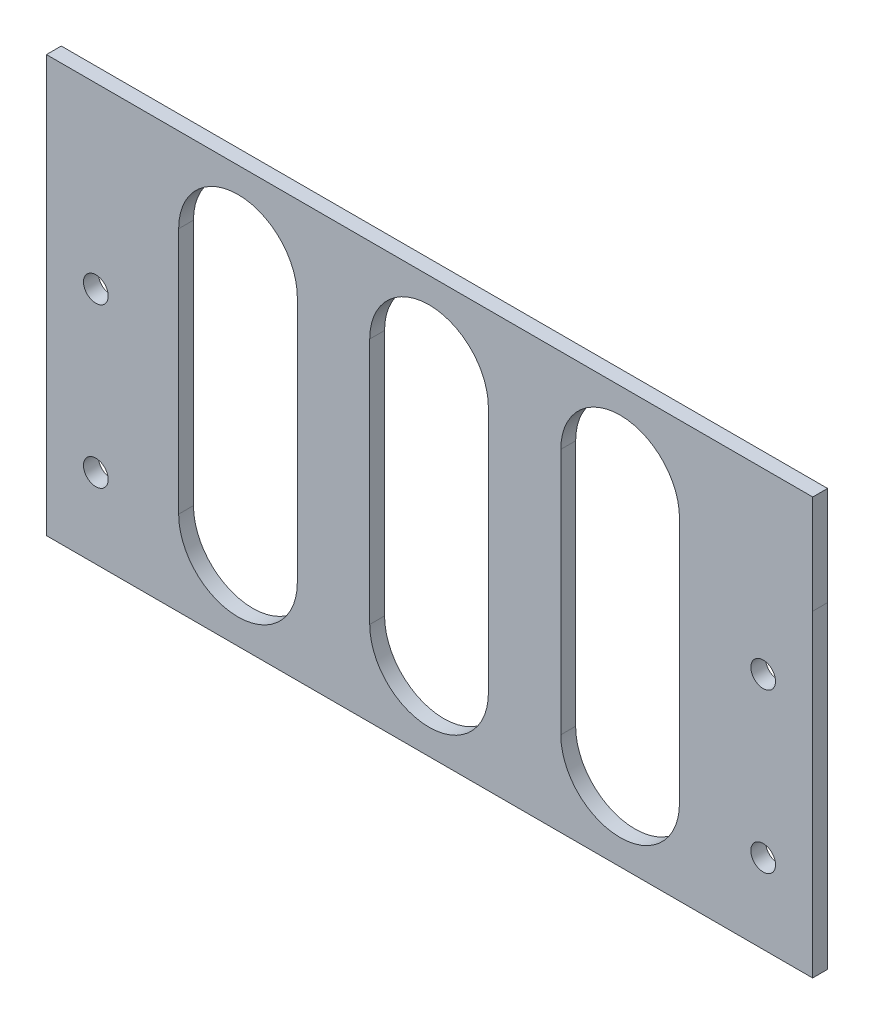
ISO-10303-21;
HEADER;
FILE_DESCRIPTION(('STEP AP214'),'2;1');
FILE_NAME('part.step','',(''),(''),'','','');
FILE_SCHEMA(('AUTOMOTIVE_DESIGN { 1 0 10303 214 1 1 1 1 }'));
ENDSEC;
DATA;
#1=APPLICATION_CONTEXT('core data for automotive mechanical design processes');
#2=APPLICATION_PROTOCOL_DEFINITION('international standard','automotive_design',2000,#1);
#3=PRODUCT_CONTEXT('',#1,'mechanical');
#4=PRODUCT('Part','Part','',(#3));
#5=PRODUCT_RELATED_PRODUCT_CATEGORY('part','',(#4));
#6=PRODUCT_DEFINITION_FORMATION('','',#4);
#7=PRODUCT_DEFINITION_CONTEXT('part definition',#1,'design');
#8=PRODUCT_DEFINITION('design','',#6,#7);
#9=PRODUCT_DEFINITION_SHAPE('','',#8);
#10=(LENGTH_UNIT() NAMED_UNIT(*) SI_UNIT(.MILLI.,.METRE.));
#11=(NAMED_UNIT(*) PLANE_ANGLE_UNIT() SI_UNIT($,.RADIAN.));
#12=(NAMED_UNIT(*) SI_UNIT($,.STERADIAN.) SOLID_ANGLE_UNIT());
#13=UNCERTAINTY_MEASURE_WITH_UNIT(LENGTH_MEASURE(1.E-05),#10,'distance_accuracy_value','');
#14=(GEOMETRIC_REPRESENTATION_CONTEXT(3) GLOBAL_UNCERTAINTY_ASSIGNED_CONTEXT((#13)) GLOBAL_UNIT_ASSIGNED_CONTEXT((#10,
#11,#12)) REPRESENTATION_CONTEXT('',''));
#15=CARTESIAN_POINT('',(0.,0.,0.));
#16=DIRECTION('',(0.,0.,1.));
#17=DIRECTION('',(1.,0.,0.));
#18=AXIS2_PLACEMENT_3D('',#15,#16,#17);
#19=CARTESIAN_POINT('',(0.,0.,0.));
#20=DIRECTION('',(0.,1.,0.));
#21=DIRECTION('',(0.,0.,1.));
#22=AXIS2_PLACEMENT_3D('',#19,#20,#21);
#23=PLANE('',#22);
#24=DIRECTION('',(0.,0.,1.));
#25=VECTOR('',#24,1.);
#26=CARTESIAN_POINT('',(-77.925054897268,0.,-1.49999999999998));
#27=LINE('',#26,#25);
#28=CARTESIAN_POINT('',(-77.925054897268,0.,-1.49999999999998));
#29=VERTEX_POINT('',#28);
#30=CARTESIAN_POINT('',(-77.925054897268,0.,1.50000000000002));
#31=VERTEX_POINT('',#30);
#32=EDGE_CURVE('E384',#29,#31,#27,.T.);
#33=ORIENTED_EDGE('',*,*,#32,.F.);
#34=DIRECTION('',(-1.,0.,0.));
#35=VECTOR('',#34,1.);
#36=CARTESIAN_POINT('',(-77.925054897268,0.,-1.49999999999998));
#37=LINE('',#36,#35);
#38=CARTESIAN_POINT('',(77.054945102732,0.,-1.49999999999998));
#39=VERTEX_POINT('',#38);
#40=EDGE_CURVE('E399',#39,#29,#37,.T.);
#41=ORIENTED_EDGE('',*,*,#40,.F.);
#42=DIRECTION('',(0.,0.,-1.));
#43=VECTOR('',#42,1.);
#44=CARTESIAN_POINT('',(77.054945102732,0.,-1.49999999999998));
#45=LINE('',#44,#43);
#46=CARTESIAN_POINT('',(77.0549451027321,0.,1.50000000000002));
#47=VERTEX_POINT('',#46);
#48=EDGE_CURVE('E395',#47,#39,#45,.T.);
#49=ORIENTED_EDGE('',*,*,#48,.F.);
#50=DIRECTION('',(1.,0.,0.));
#51=VECTOR('',#50,1.);
#52=CARTESIAN_POINT('',(-77.925054897268,0.,1.50000000000002));
#53=LINE('',#52,#51);
#54=EDGE_CURVE('E391',#31,#47,#53,.T.);
#55=ORIENTED_EDGE('',*,*,#54,.F.);
#56=EDGE_LOOP('',(#33,#41,#49,#55));
#57=FACE_BOUND('',#56,.T.);
#58=ADVANCED_FACE('F38',(#57),#23,.F.);
#59=CARTESIAN_POINT('',(-77.925054897268,219.279033285161,-1.49999999999998));
#60=DIRECTION('',(0.,0.,1.));
#61=DIRECTION('',(1.,0.,0.));
#62=AXIS2_PLACEMENT_3D('',#59,#60,#61);
#63=PLANE('',#62);
#64=DIRECTION('',(0.,1.,0.));
#65=VECTOR('',#64,1.);
#66=CARTESIAN_POINT('',(-27.180054897268,219.279033285161,-1.49999999999998));
#67=LINE('',#66,#65);
#68=CARTESIAN_POINT('',(-27.180054897268,17.135,-1.49999999999998));
#69=VERTEX_POINT('',#68);
#70=CARTESIAN_POINT('',(-27.180054897268,67.135,-1.49999999999998));
#71=VERTEX_POINT('',#70);
#72=EDGE_CURVE('E318',#69,#71,#67,.T.);
#73=ORIENTED_EDGE('',*,*,#72,.T.);
#74=CARTESIAN_POINT('',(-39.180054897268,67.135,-1.49999999999998));
#75=DIRECTION('',(0.,0.,1.));
#76=DIRECTION('',(1.,0.,0.));
#77=AXIS2_PLACEMENT_3D('',#74,#75,#76);
#78=CIRCLE('',#77,12.);
#79=CARTESIAN_POINT('',(-51.180054897268,67.135,-1.49999999999998));
#80=VERTEX_POINT('',#79);
#81=EDGE_CURVE('E322',#71,#80,#78,.T.);
#82=ORIENTED_EDGE('',*,*,#81,.T.);
#83=DIRECTION('',(0.,-1.,0.));
#84=VECTOR('',#83,1.);
#85=CARTESIAN_POINT('',(-51.180054897268,219.279033285161,-1.49999999999998));
#86=LINE('',#85,#84);
#87=CARTESIAN_POINT('',(-51.180054897268,17.135,-1.49999999999998));
#88=VERTEX_POINT('',#87);
#89=EDGE_CURVE('E313',#80,#88,#86,.T.);
#90=ORIENTED_EDGE('',*,*,#89,.T.);
#91=CARTESIAN_POINT('',(-39.180054897268,17.135,-1.49999999999998));
#92=DIRECTION('',(0.,0.,1.));
#93=DIRECTION('',(1.,0.,0.));
#94=AXIS2_PLACEMENT_3D('',#91,#92,#93);
#95=CIRCLE('',#94,12.);
#96=EDGE_CURVE('E197',#88,#69,#95,.T.);
#97=ORIENTED_EDGE('',*,*,#96,.T.);
#98=EDGE_LOOP('',(#73,#82,#90,#97));
#99=FACE_BOUND('',#98,.T.);
#100=DIRECTION('',(0.,1.,0.));
#101=VECTOR('',#100,1.);
#102=CARTESIAN_POINT('',(11.469945102732,219.279033285161,-1.49999999999998));
#103=LINE('',#102,#101);
#104=CARTESIAN_POINT('',(11.469945102732,17.135,-1.49999999999998));
#105=VERTEX_POINT('',#104);
#106=CARTESIAN_POINT('',(11.469945102732,67.135,-1.49999999999998));
#107=VERTEX_POINT('',#106);
#108=EDGE_CURVE('E305',#105,#107,#103,.T.);
#109=ORIENTED_EDGE('',*,*,#108,.T.);
#110=CARTESIAN_POINT('',(-0.530054897267963,67.135,-1.49999999999998));
#111=DIRECTION('',(0.,0.,1.));
#112=DIRECTION('',(1.,0.,0.));
#113=AXIS2_PLACEMENT_3D('',#110,#111,#112);
#114=CIRCLE('',#113,12.);
#115=CARTESIAN_POINT('',(-12.530054897268,67.135,-1.49999999999998));
#116=VERTEX_POINT('',#115);
#117=EDGE_CURVE('E309',#107,#116,#114,.T.);
#118=ORIENTED_EDGE('',*,*,#117,.T.);
#119=DIRECTION('',(0.,-1.,0.));
#120=VECTOR('',#119,1.);
#121=CARTESIAN_POINT('',(-12.530054897268,219.279033285161,-1.49999999999998));
#122=LINE('',#121,#120);
#123=CARTESIAN_POINT('',(-12.530054897268,17.135,-1.49999999999998));
#124=VERTEX_POINT('',#123);
#125=EDGE_CURVE('E297',#116,#124,#122,.T.);
#126=ORIENTED_EDGE('',*,*,#125,.T.);
#127=CARTESIAN_POINT('',(-0.530054897267963,17.135,-1.49999999999998));
#128=DIRECTION('',(0.,0.,1.));
#129=DIRECTION('',(1.,0.,0.));
#130=AXIS2_PLACEMENT_3D('',#127,#128,#129);
#131=CIRCLE('',#130,12.);
#132=EDGE_CURVE('E301',#124,#105,#131,.T.);
#133=ORIENTED_EDGE('',*,*,#132,.T.);
#134=EDGE_LOOP('',(#109,#118,#126,#133));
#135=FACE_BOUND('',#134,.T.);
#136=DIRECTION('',(0.,1.,0.));
#137=VECTOR('',#136,1.);
#138=CARTESIAN_POINT('',(50.119945102732,219.279033285161,-1.49999999999998));
#139=LINE('',#138,#137);
#140=CARTESIAN_POINT('',(50.119945102732,17.135,-1.49999999999998));
#141=VERTEX_POINT('',#140);
#142=CARTESIAN_POINT('',(50.119945102732,67.135,-1.49999999999998));
#143=VERTEX_POINT('',#142);
#144=EDGE_CURVE('E289',#141,#143,#139,.T.);
#145=ORIENTED_EDGE('',*,*,#144,.T.);
#146=CARTESIAN_POINT('',(38.119945102732,67.135,-1.49999999999998));
#147=DIRECTION('',(0.,0.,1.));
#148=DIRECTION('',(1.,0.,0.));
#149=AXIS2_PLACEMENT_3D('',#146,#147,#148);
#150=CIRCLE('',#149,12.);
#151=CARTESIAN_POINT('',(26.119945102732,67.135,-1.49999999999998));
#152=VERTEX_POINT('',#151);
#153=EDGE_CURVE('E293',#143,#152,#150,.T.);
#154=ORIENTED_EDGE('',*,*,#153,.T.);
#155=DIRECTION('',(0.,-1.,0.));
#156=VECTOR('',#155,1.);
#157=CARTESIAN_POINT('',(26.119945102732,219.279033285161,-1.49999999999998));
#158=LINE('',#157,#156);
#159=CARTESIAN_POINT('',(26.119945102732,17.135,-1.49999999999998));
#160=VERTEX_POINT('',#159);
#161=EDGE_CURVE('E227',#152,#160,#158,.T.);
#162=ORIENTED_EDGE('',*,*,#161,.T.);
#163=CARTESIAN_POINT('',(38.119945102732,17.135,-1.49999999999998));
#164=DIRECTION('',(0.,0.,1.));
#165=DIRECTION('',(1.,0.,0.));
#166=AXIS2_PLACEMENT_3D('',#163,#164,#165);
#167=CIRCLE('',#166,12.);
#168=EDGE_CURVE('E285',#160,#141,#167,.T.);
#169=ORIENTED_EDGE('',*,*,#168,.T.);
#170=EDGE_LOOP('',(#145,#154,#162,#169));
#171=FACE_BOUND('',#170,.T.);
#172=CARTESIAN_POINT('',(67.054945102732,16.0675,-1.49999999999998));
#173=DIRECTION('',(0.,0.,1.));
#174=DIRECTION('',(1.,0.,0.));
#175=AXIS2_PLACEMENT_3D('',#172,#173,#174);
#176=CIRCLE('',#175,2.50000000000001);
#177=CARTESIAN_POINT('',(69.5549451027321,16.0675,-1.49999999999998));
#178=VERTEX_POINT('',#177);
#179=EDGE_CURVE('E373',#178,#178,#176,.T.);
#180=ORIENTED_EDGE('',*,*,#179,.T.);
#181=EDGE_LOOP('',(#180));
#182=FACE_BOUND('',#181,.T.);
#183=CARTESIAN_POINT('',(67.054945102732,48.2025,-1.49999999999998));
#184=DIRECTION('',(0.,0.,1.));
#185=DIRECTION('',(1.,0.,0.));
#186=AXIS2_PLACEMENT_3D('',#183,#184,#185);
#187=CIRCLE('',#186,2.50000000000001);
#188=CARTESIAN_POINT('',(69.554945102732,48.2025,-1.49999999999998));
#189=VERTEX_POINT('',#188);
#190=EDGE_CURVE('E365',#189,#189,#187,.T.);
#191=ORIENTED_EDGE('',*,*,#190,.T.);
#192=EDGE_LOOP('',(#191));
#193=FACE_BOUND('',#192,.T.);
#194=CARTESIAN_POINT('',(-67.925054897268,48.2025,-1.49999999999998));
#195=DIRECTION('',(0.,0.,1.));
#196=DIRECTION('',(1.,0.,0.));
#197=AXIS2_PLACEMENT_3D('',#194,#195,#196);
#198=CIRCLE('',#197,2.5);
#199=CARTESIAN_POINT('',(-65.425054897268,48.2025,-1.49999999999998));
#200=VERTEX_POINT('',#199);
#201=EDGE_CURVE('E356',#200,#200,#198,.T.);
#202=ORIENTED_EDGE('',*,*,#201,.T.);
#203=EDGE_LOOP('',(#202));
#204=FACE_BOUND('',#203,.T.);
#205=CARTESIAN_POINT('',(-67.925054897268,16.0675,-1.49999999999998));
#206=DIRECTION('',(0.,0.,1.));
#207=DIRECTION('',(1.,0.,0.));
#208=AXIS2_PLACEMENT_3D('',#205,#206,#207);
#209=CIRCLE('',#208,2.50000000000001);
#210=CARTESIAN_POINT('',(-65.425054897268,16.0675,-1.49999999999998));
#211=VERTEX_POINT('',#210);
#212=EDGE_CURVE('E380',#211,#211,#209,.T.);
#213=ORIENTED_EDGE('',*,*,#212,.T.);
#214=EDGE_LOOP('',(#213));
#215=FACE_BOUND('',#214,.T.);
#216=DIRECTION('',(0.,-1.,0.));
#217=VECTOR('',#216,1.);
#218=CARTESIAN_POINT('',(-77.925054897268,219.279033285161,-1.49999999999998));
#219=LINE('',#218,#217);
#220=CARTESIAN_POINT('',(-77.925054897268,84.27,-1.49999999999998));
#221=VERTEX_POINT('',#220);
#222=EDGE_CURVE('E403',#221,#29,#219,.T.);
#223=ORIENTED_EDGE('',*,*,#222,.F.);
#224=DIRECTION('',(-1.,0.,0.));
#225=VECTOR('',#224,1.);
#226=CARTESIAN_POINT('',(-77.925054897268,84.27,-1.49999999999998));
#227=LINE('',#226,#225);
#228=CARTESIAN_POINT('',(77.0793093239953,84.27,-1.49999999999998));
#229=VERTEX_POINT('',#228);
#230=EDGE_CURVE('E333',#229,#221,#227,.T.);
#231=ORIENTED_EDGE('',*,*,#230,.F.);
#232=DIRECTION('',(0.,1.,0.));
#233=VECTOR('',#232,1.);
#234=CARTESIAN_POINT('',(77.0793093239953,64.27,-1.49999999999998));
#235=LINE('',#234,#233);
#236=CARTESIAN_POINT('',(77.0793093239953,64.27,-1.49999999999998));
#237=VERTEX_POINT('',#236);
#238=EDGE_CURVE('E329',#237,#229,#235,.T.);
#239=ORIENTED_EDGE('',*,*,#238,.F.);
#240=DIRECTION('',(1.,0.,0.));
#241=VECTOR('',#240,1.);
#242=CARTESIAN_POINT('',(-77.925054897268,64.27,-1.49999999999998));
#243=LINE('',#242,#241);
#244=CARTESIAN_POINT('',(77.054945102732,64.27,-1.49999999999998));
#245=VERTEX_POINT('',#244);
#246=EDGE_CURVE('E327',#245,#237,#243,.T.);
#247=ORIENTED_EDGE('',*,*,#246,.F.);
#248=DIRECTION('',(0.,-1.,0.));
#249=VECTOR('',#248,1.);
#250=CARTESIAN_POINT('',(77.054945102732,219.279033285161,-1.49999999999998));
#251=LINE('',#250,#249);
#252=EDGE_CURVE('E406',#245,#39,#251,.T.);
#253=ORIENTED_EDGE('',*,*,#252,.T.);
#254=ORIENTED_EDGE('',*,*,#40,.T.);
#255=EDGE_LOOP('',(#223,#231,#239,#247,#253,#254));
#256=FACE_BOUND('',#255,.T.);
#257=ADVANCED_FACE('F424',(#99,#135,#171,#182,#193,#204,#215,#256),#63,.F.);
#258=CARTESIAN_POINT('',(77.054945102732,219.279033285161,-1.49999999999998));
#259=DIRECTION('',(-1.,0.,0.));
#260=DIRECTION('',(0.,0.,1.));
#261=AXIS2_PLACEMENT_3D('',#258,#259,#260);
#262=PLANE('',#261);
#263=ORIENTED_EDGE('',*,*,#252,.F.);
#264=DIRECTION('',(0.,0.,1.));
#265=VECTOR('',#264,1.);
#266=CARTESIAN_POINT('',(77.054945102732,64.27,-1.49999999999998));
#267=LINE('',#266,#265);
#268=CARTESIAN_POINT('',(77.0549451027321,64.27,1.50000000000002));
#269=VERTEX_POINT('',#268);
#270=EDGE_CURVE('E11',#245,#269,#267,.T.);
#271=ORIENTED_EDGE('',*,*,#270,.T.);
#272=DIRECTION('',(0.,-1.,0.));
#273=VECTOR('',#272,1.);
#274=CARTESIAN_POINT('',(77.0549451027321,219.279033285161,1.50000000000002));
#275=LINE('',#274,#273);
#276=EDGE_CURVE('E408',#269,#47,#275,.T.);
#277=ORIENTED_EDGE('',*,*,#276,.T.);
#278=ORIENTED_EDGE('',*,*,#48,.T.);
#279=EDGE_LOOP('',(#263,#271,#277,#278));
#280=FACE_BOUND('',#279,.T.);
#281=ADVANCED_FACE('F428',(#280),#262,.F.);
#282=CARTESIAN_POINT('',(-77.925054897268,219.279033285161,1.50000000000002));
#283=DIRECTION('',(0.,0.,-1.));
#284=DIRECTION('',(-1.,0.,0.));
#285=AXIS2_PLACEMENT_3D('',#282,#283,#284);
#286=PLANE('',#285);
#287=DIRECTION('',(0.,-1.,0.));
#288=VECTOR('',#287,1.);
#289=CARTESIAN_POINT('',(-51.180054897268,67.135,1.50000000000002));
#290=LINE('',#289,#288);
#291=CARTESIAN_POINT('',(-51.180054897268,67.135,1.50000000000002));
#292=VERTEX_POINT('',#291);
#293=CARTESIAN_POINT('',(-51.180054897268,17.135,1.50000000000002));
#294=VERTEX_POINT('',#293);
#295=EDGE_CURVE('E205',#292,#294,#290,.T.);
#296=ORIENTED_EDGE('',*,*,#295,.F.);
#297=CARTESIAN_POINT('',(-39.180054897268,67.135,1.50000000000002));
#298=DIRECTION('',(0.,0.,1.));
#299=DIRECTION('',(1.,0.,0.));
#300=AXIS2_PLACEMENT_3D('',#297,#298,#299);
#301=CIRCLE('',#300,12.);
#302=CARTESIAN_POINT('',(-27.180054897268,67.135,1.50000000000002));
#303=VERTEX_POINT('',#302);
#304=EDGE_CURVE('E211',#303,#292,#301,.T.);
#305=ORIENTED_EDGE('',*,*,#304,.F.);
#306=DIRECTION('',(0.,1.,0.));
#307=VECTOR('',#306,1.);
#308=CARTESIAN_POINT('',(-27.180054897268,67.135,1.50000000000002));
#309=LINE('',#308,#307);
#310=CARTESIAN_POINT('',(-27.180054897268,17.135,1.50000000000002));
#311=VERTEX_POINT('',#310);
#312=EDGE_CURVE('E216',#311,#303,#309,.T.);
#313=ORIENTED_EDGE('',*,*,#312,.F.);
#314=CARTESIAN_POINT('',(-39.180054897268,17.135,1.50000000000002));
#315=DIRECTION('',(0.,0.,1.));
#316=DIRECTION('',(1.,0.,0.));
#317=AXIS2_PLACEMENT_3D('',#314,#315,#316);
#318=CIRCLE('',#317,12.);
#319=EDGE_CURVE('E194',#294,#311,#318,.T.);
#320=ORIENTED_EDGE('',*,*,#319,.F.);
#321=EDGE_LOOP('',(#296,#305,#313,#320));
#322=FACE_BOUND('',#321,.T.);
#323=DIRECTION('',(0.,-1.,0.));
#324=VECTOR('',#323,1.);
#325=CARTESIAN_POINT('',(-12.530054897268,67.135,1.50000000000002));
#326=LINE('',#325,#324);
#327=CARTESIAN_POINT('',(-12.530054897268,67.135,1.50000000000002));
#328=VERTEX_POINT('',#327);
#329=CARTESIAN_POINT('',(-12.530054897268,17.135,1.50000000000002));
#330=VERTEX_POINT('',#329);
#331=EDGE_CURVE('E233',#328,#330,#326,.T.);
#332=ORIENTED_EDGE('',*,*,#331,.F.);
#333=CARTESIAN_POINT('',(-0.530054897267963,67.135,1.50000000000002));
#334=DIRECTION('',(0.,0.,1.));
#335=DIRECTION('',(1.,0.,0.));
#336=AXIS2_PLACEMENT_3D('',#333,#334,#335);
#337=CIRCLE('',#336,12.);
#338=CARTESIAN_POINT('',(11.469945102732,67.135,1.50000000000002));
#339=VERTEX_POINT('',#338);
#340=EDGE_CURVE('E231',#339,#328,#337,.T.);
#341=ORIENTED_EDGE('',*,*,#340,.F.);
#342=DIRECTION('',(0.,1.,0.));
#343=VECTOR('',#342,1.);
#344=CARTESIAN_POINT('',(11.469945102732,67.135,1.50000000000002));
#345=LINE('',#344,#343);
#346=CARTESIAN_POINT('',(11.469945102732,17.135,1.50000000000002));
#347=VERTEX_POINT('',#346);
#348=EDGE_CURVE('E241',#347,#339,#345,.T.);
#349=ORIENTED_EDGE('',*,*,#348,.F.);
#350=CARTESIAN_POINT('',(-0.530054897267963,17.135,1.50000000000002));
#351=DIRECTION('',(0.,0.,1.));
#352=DIRECTION('',(1.,0.,0.));
#353=AXIS2_PLACEMENT_3D('',#350,#351,#352);
#354=CIRCLE('',#353,12.);
#355=EDGE_CURVE('E237',#330,#347,#354,.T.);
#356=ORIENTED_EDGE('',*,*,#355,.F.);
#357=EDGE_LOOP('',(#332,#341,#349,#356));
#358=FACE_BOUND('',#357,.T.);
#359=DIRECTION('',(0.,-1.,0.));
#360=VECTOR('',#359,1.);
#361=CARTESIAN_POINT('',(26.119945102732,67.135,1.50000000000002));
#362=LINE('',#361,#360);
#363=CARTESIAN_POINT('',(26.119945102732,67.135,1.50000000000002));
#364=VERTEX_POINT('',#363);
#365=CARTESIAN_POINT('',(26.119945102732,17.135,1.50000000000002));
#366=VERTEX_POINT('',#365);
#367=EDGE_CURVE('E259',#364,#366,#362,.T.);
#368=ORIENTED_EDGE('',*,*,#367,.F.);
#369=CARTESIAN_POINT('',(38.119945102732,67.135,1.50000000000002));
#370=DIRECTION('',(0.,0.,1.));
#371=DIRECTION('',(1.,0.,0.));
#372=AXIS2_PLACEMENT_3D('',#369,#370,#371);
#373=CIRCLE('',#372,12.);
#374=CARTESIAN_POINT('',(50.119945102732,67.135,1.50000000000002));
#375=VERTEX_POINT('',#374);
#376=EDGE_CURVE('E256',#375,#364,#373,.T.);
#377=ORIENTED_EDGE('',*,*,#376,.F.);
#378=DIRECTION('',(0.,1.,0.));
#379=VECTOR('',#378,1.);
#380=CARTESIAN_POINT('',(50.119945102732,67.135,1.50000000000002));
#381=LINE('',#380,#379);
#382=CARTESIAN_POINT('',(50.119945102732,17.135,1.50000000000002));
#383=VERTEX_POINT('',#382);
#384=EDGE_CURVE('E267',#383,#375,#381,.T.);
#385=ORIENTED_EDGE('',*,*,#384,.F.);
#386=CARTESIAN_POINT('',(38.119945102732,17.135,1.50000000000002));
#387=DIRECTION('',(0.,0.,1.));
#388=DIRECTION('',(1.,0.,0.));
#389=AXIS2_PLACEMENT_3D('',#386,#387,#388);
#390=CIRCLE('',#389,12.);
#391=EDGE_CURVE('E263',#366,#383,#390,.T.);
#392=ORIENTED_EDGE('',*,*,#391,.F.);
#393=EDGE_LOOP('',(#368,#377,#385,#392));
#394=FACE_BOUND('',#393,.T.);
#395=CARTESIAN_POINT('',(67.054945102732,16.0675,1.50000000000002));
#396=DIRECTION('',(0.,0.,1.));
#397=DIRECTION('',(1.,0.,0.));
#398=AXIS2_PLACEMENT_3D('',#395,#396,#397);
#399=CIRCLE('',#398,2.50000000000001);
#400=CARTESIAN_POINT('',(69.5549451027321,16.0675,1.50000000000002));
#401=VERTEX_POINT('',#400);
#402=EDGE_CURVE('E350',#401,#401,#399,.T.);
#403=ORIENTED_EDGE('',*,*,#402,.F.);
#404=EDGE_LOOP('',(#403));
#405=FACE_BOUND('',#404,.T.);
#406=CARTESIAN_POINT('',(67.054945102732,48.2025,1.50000000000002));
#407=DIRECTION('',(0.,0.,1.));
#408=DIRECTION('',(1.,0.,0.));
#409=AXIS2_PLACEMENT_3D('',#406,#407,#408);
#410=CIRCLE('',#409,2.50000000000001);
#411=CARTESIAN_POINT('',(69.554945102732,48.2025,1.50000000000002));
#412=VERTEX_POINT('',#411);
#413=EDGE_CURVE('E369',#412,#412,#410,.T.);
#414=ORIENTED_EDGE('',*,*,#413,.F.);
#415=EDGE_LOOP('',(#414));
#416=FACE_BOUND('',#415,.T.);
#417=CARTESIAN_POINT('',(-67.925054897268,48.2025,1.50000000000002));
#418=DIRECTION('',(0.,0.,1.));
#419=DIRECTION('',(1.,0.,0.));
#420=AXIS2_PLACEMENT_3D('',#417,#418,#419);
#421=CIRCLE('',#420,2.5);
#422=CARTESIAN_POINT('',(-65.425054897268,48.2025,1.50000000000002));
#423=VERTEX_POINT('',#422);
#424=EDGE_CURVE('E361',#423,#423,#421,.T.);
#425=ORIENTED_EDGE('',*,*,#424,.F.);
#426=EDGE_LOOP('',(#425));
#427=FACE_BOUND('',#426,.T.);
#428=CARTESIAN_POINT('',(-67.925054897268,16.0675,1.50000000000002));
#429=DIRECTION('',(0.,0.,1.));
#430=DIRECTION('',(1.,0.,0.));
#431=AXIS2_PLACEMENT_3D('',#428,#429,#430);
#432=CIRCLE('',#431,2.50000000000001);
#433=CARTESIAN_POINT('',(-65.425054897268,16.0675,1.50000000000002));
#434=VERTEX_POINT('',#433);
#435=EDGE_CURVE('E360',#434,#434,#432,.T.);
#436=ORIENTED_EDGE('',*,*,#435,.F.);
#437=EDGE_LOOP('',(#436));
#438=FACE_BOUND('',#437,.T.);
#439=ORIENTED_EDGE('',*,*,#276,.F.);
#440=DIRECTION('',(1.,0.,0.));
#441=VECTOR('',#440,1.);
#442=CARTESIAN_POINT('',(-77.925054897268,64.27,1.50000000000002));
#443=LINE('',#442,#441);
#444=CARTESIAN_POINT('',(77.0793093239953,64.27,1.50000000000002));
#445=VERTEX_POINT('',#444);
#446=EDGE_CURVE('E326',#269,#445,#443,.T.);
#447=ORIENTED_EDGE('',*,*,#446,.T.);
#448=DIRECTION('',(0.,1.,0.));
#449=VECTOR('',#448,1.);
#450=CARTESIAN_POINT('',(77.0793093239953,64.27,1.50000000000002));
#451=LINE('',#450,#449);
#452=CARTESIAN_POINT('',(77.0793093239953,84.27,1.50000000000002));
#453=VERTEX_POINT('',#452);
#454=EDGE_CURVE('E340',#445,#453,#451,.T.);
#455=ORIENTED_EDGE('',*,*,#454,.T.);
#456=DIRECTION('',(-1.,0.,0.));
#457=VECTOR('',#456,1.);
#458=CARTESIAN_POINT('',(-77.925054897268,84.27,1.50000000000002));
#459=LINE('',#458,#457);
#460=CARTESIAN_POINT('',(-77.925054897268,84.27,1.50000000000002));
#461=VERTEX_POINT('',#460);
#462=EDGE_CURVE('E330',#453,#461,#459,.T.);
#463=ORIENTED_EDGE('',*,*,#462,.T.);
#464=DIRECTION('',(0.,-1.,0.));
#465=VECTOR('',#464,1.);
#466=CARTESIAN_POINT('',(-77.925054897268,219.279033285161,1.50000000000002));
#467=LINE('',#466,#465);
#468=EDGE_CURVE('E42',#461,#31,#467,.T.);
#469=ORIENTED_EDGE('',*,*,#468,.T.);
#470=ORIENTED_EDGE('',*,*,#54,.T.);
#471=EDGE_LOOP('',(#439,#447,#455,#463,#469,#470));
#472=FACE_BOUND('',#471,.T.);
#473=ADVANCED_FACE('F213',(#322,#358,#394,#405,#416,#427,#438,#472),#286,.F.);
#474=CARTESIAN_POINT('',(-77.925054897268,219.279033285161,-1.49999999999998));
#475=DIRECTION('',(1.,0.,0.));
#476=DIRECTION('',(0.,0.,-1.));
#477=AXIS2_PLACEMENT_3D('',#474,#475,#476);
#478=PLANE('',#477);
#479=ORIENTED_EDGE('',*,*,#468,.F.);
#480=DIRECTION('',(0.,0.,1.));
#481=VECTOR('',#480,1.);
#482=CARTESIAN_POINT('',(-77.925054897268,84.27,-1.49999999999998));
#483=LINE('',#482,#481);
#484=EDGE_CURVE('E346',#221,#461,#483,.T.);
#485=ORIENTED_EDGE('',*,*,#484,.F.);
#486=ORIENTED_EDGE('',*,*,#222,.T.);
#487=ORIENTED_EDGE('',*,*,#32,.T.);
#488=EDGE_LOOP('',(#479,#485,#486,#487));
#489=FACE_BOUND('',#488,.T.);
#490=ADVANCED_FACE('F40',(#489),#478,.F.);
#491=CARTESIAN_POINT('',(-67.925054897268,16.0675,-1.49999999999998));
#492=DIRECTION('',(0.,0.,1.));
#493=DIRECTION('',(1.,0.,0.));
#494=AXIS2_PLACEMENT_3D('',#491,#492,#493);
#495=CYLINDRICAL_SURFACE('',#494,2.50000000000001);
#496=ORIENTED_EDGE('',*,*,#212,.F.);
#497=EDGE_LOOP('',(#496));
#498=FACE_BOUND('',#497,.T.);
#499=ORIENTED_EDGE('',*,*,#435,.T.);
#500=EDGE_LOOP('',(#499));
#501=FACE_BOUND('',#500,.T.);
#502=ADVANCED_FACE('F442',(#498,#501),#495,.F.);
#503=CARTESIAN_POINT('',(-67.925054897268,48.2025,-1.49999999999998));
#504=DIRECTION('',(0.,0.,1.));
#505=DIRECTION('',(1.,0.,0.));
#506=AXIS2_PLACEMENT_3D('',#503,#504,#505);
#507=CYLINDRICAL_SURFACE('',#506,2.5);
#508=ORIENTED_EDGE('',*,*,#201,.F.);
#509=EDGE_LOOP('',(#508));
#510=FACE_BOUND('',#509,.T.);
#511=ORIENTED_EDGE('',*,*,#424,.T.);
#512=EDGE_LOOP('',(#511));
#513=FACE_BOUND('',#512,.T.);
#514=ADVANCED_FACE('F445',(#510,#513),#507,.F.);
#515=CARTESIAN_POINT('',(67.054945102732,48.2025,-1.49999999999998));
#516=DIRECTION('',(0.,0.,1.));
#517=DIRECTION('',(1.,0.,0.));
#518=AXIS2_PLACEMENT_3D('',#515,#516,#517);
#519=CYLINDRICAL_SURFACE('',#518,2.50000000000001);
#520=ORIENTED_EDGE('',*,*,#190,.F.);
#521=EDGE_LOOP('',(#520));
#522=FACE_BOUND('',#521,.T.);
#523=ORIENTED_EDGE('',*,*,#413,.T.);
#524=EDGE_LOOP('',(#523));
#525=FACE_BOUND('',#524,.T.);
#526=ADVANCED_FACE('F451',(#522,#525),#519,.F.);
#527=CARTESIAN_POINT('',(67.054945102732,16.0675,-1.49999999999998));
#528=DIRECTION('',(0.,0.,1.));
#529=DIRECTION('',(1.,0.,0.));
#530=AXIS2_PLACEMENT_3D('',#527,#528,#529);
#531=CYLINDRICAL_SURFACE('',#530,2.50000000000001);
#532=ORIENTED_EDGE('',*,*,#179,.F.);
#533=EDGE_LOOP('',(#532));
#534=FACE_BOUND('',#533,.T.);
#535=ORIENTED_EDGE('',*,*,#402,.T.);
#536=EDGE_LOOP('',(#535));
#537=FACE_BOUND('',#536,.T.);
#538=ADVANCED_FACE('F447',(#534,#537),#531,.F.);
#539=CARTESIAN_POINT('',(-77.925054897268,64.27,-1.49999999999998));
#540=DIRECTION('',(0.,-1.,0.));
#541=DIRECTION('',(0.,0.,-1.));
#542=AXIS2_PLACEMENT_3D('',#539,#540,#541);
#543=PLANE('',#542);
#544=ORIENTED_EDGE('',*,*,#270,.F.);
#545=ORIENTED_EDGE('',*,*,#246,.T.);
#546=DIRECTION('',(0.,0.,1.));
#547=VECTOR('',#546,1.);
#548=CARTESIAN_POINT('',(77.0793093239953,64.27,-1.49999999999998));
#549=LINE('',#548,#547);
#550=EDGE_CURVE('E337',#237,#445,#549,.T.);
#551=ORIENTED_EDGE('',*,*,#550,.T.);
#552=ORIENTED_EDGE('',*,*,#446,.F.);
#553=EDGE_LOOP('',(#544,#545,#551,#552));
#554=FACE_BOUND('',#553,.T.);
#555=ADVANCED_FACE('F450',(#554),#543,.T.);
#556=CARTESIAN_POINT('',(-77.925054897268,84.27,-1.49999999999998));
#557=DIRECTION('',(0.,1.,0.));
#558=DIRECTION('',(0.,0.,1.));
#559=AXIS2_PLACEMENT_3D('',#556,#557,#558);
#560=PLANE('',#559);
#561=ORIENTED_EDGE('',*,*,#462,.F.);
#562=DIRECTION('',(0.,0.,1.));
#563=VECTOR('',#562,1.);
#564=CARTESIAN_POINT('',(77.0793093239953,84.27,-1.49999999999998));
#565=LINE('',#564,#563);
#566=EDGE_CURVE('E351',#229,#453,#565,.T.);
#567=ORIENTED_EDGE('',*,*,#566,.F.);
#568=ORIENTED_EDGE('',*,*,#230,.T.);
#569=ORIENTED_EDGE('',*,*,#484,.T.);
#570=EDGE_LOOP('',(#561,#567,#568,#569));
#571=FACE_BOUND('',#570,.T.);
#572=ADVANCED_FACE('F461',(#571),#560,.T.);
#573=CARTESIAN_POINT('',(77.0793093239953,64.27,-1.49999999999998));
#574=DIRECTION('',(1.,0.,0.));
#575=DIRECTION('',(0.,0.,-1.));
#576=AXIS2_PLACEMENT_3D('',#573,#574,#575);
#577=PLANE('',#576);
#578=ORIENTED_EDGE('',*,*,#454,.F.);
#579=ORIENTED_EDGE('',*,*,#550,.F.);
#580=ORIENTED_EDGE('',*,*,#238,.T.);
#581=ORIENTED_EDGE('',*,*,#566,.T.);
#582=EDGE_LOOP('',(#578,#579,#580,#581));
#583=FACE_BOUND('',#582,.T.);
#584=ADVANCED_FACE('F463',(#583),#577,.T.);
#585=CARTESIAN_POINT('',(38.119945102732,67.135,-8.49999999999999));
#586=DIRECTION('',(0.,0.,1.));
#587=DIRECTION('',(1.,0.,0.));
#588=AXIS2_PLACEMENT_3D('',#585,#586,#587);
#589=CYLINDRICAL_SURFACE('',#588,12.);
#590=DIRECTION('',(0.,0.,1.));
#591=VECTOR('',#590,1.);
#592=CARTESIAN_POINT('',(50.119945102732,67.135,-8.49999999999999));
#593=LINE('',#592,#591);
#594=EDGE_CURVE('E234',#143,#375,#593,.T.);
#595=ORIENTED_EDGE('',*,*,#594,.T.);
#596=ORIENTED_EDGE('',*,*,#376,.T.);
#597=DIRECTION('',(0.,0.,1.));
#598=VECTOR('',#597,1.);
#599=CARTESIAN_POINT('',(26.119945102732,67.135,-8.49999999999999));
#600=LINE('',#599,#598);
#601=EDGE_CURVE('E270',#152,#364,#600,.T.);
#602=ORIENTED_EDGE('',*,*,#601,.F.);
#603=ORIENTED_EDGE('',*,*,#153,.F.);
#604=EDGE_LOOP('',(#595,#596,#602,#603));
#605=FACE_BOUND('',#604,.T.);
#606=ADVANCED_FACE('F466',(#605),#589,.F.);
#607=CARTESIAN_POINT('',(50.119945102732,67.135,-8.49999999999999));
#608=DIRECTION('',(1.,0.,0.));
#609=DIRECTION('',(0.,1.,0.));
#610=AXIS2_PLACEMENT_3D('',#607,#608,#609);
#611=PLANE('',#610);
#612=DIRECTION('',(0.,0.,1.));
#613=VECTOR('',#612,1.);
#614=CARTESIAN_POINT('',(50.119945102732,17.135,-8.49999999999999));
#615=LINE('',#614,#613);
#616=EDGE_CURVE('E273',#141,#383,#615,.T.);
#617=ORIENTED_EDGE('',*,*,#616,.T.);
#618=ORIENTED_EDGE('',*,*,#384,.T.);
#619=ORIENTED_EDGE('',*,*,#594,.F.);
#620=ORIENTED_EDGE('',*,*,#144,.F.);
#621=EDGE_LOOP('',(#617,#618,#619,#620));
#622=FACE_BOUND('',#621,.T.);
#623=ADVANCED_FACE('F473',(#622),#611,.F.);
#624=CARTESIAN_POINT('',(38.119945102732,17.135,-8.49999999999999));
#625=DIRECTION('',(0.,0.,1.));
#626=DIRECTION('',(1.,0.,0.));
#627=AXIS2_PLACEMENT_3D('',#624,#625,#626);
#628=CYLINDRICAL_SURFACE('',#627,12.);
#629=DIRECTION('',(0.,0.,1.));
#630=VECTOR('',#629,1.);
#631=CARTESIAN_POINT('',(26.119945102732,17.135,-8.49999999999999));
#632=LINE('',#631,#630);
#633=EDGE_CURVE('E276',#160,#366,#632,.T.);
#634=ORIENTED_EDGE('',*,*,#633,.T.);
#635=ORIENTED_EDGE('',*,*,#391,.T.);
#636=ORIENTED_EDGE('',*,*,#616,.F.);
#637=ORIENTED_EDGE('',*,*,#168,.F.);
#638=EDGE_LOOP('',(#634,#635,#636,#637));
#639=FACE_BOUND('',#638,.T.);
#640=ADVANCED_FACE('F479',(#639),#628,.F.);
#641=CARTESIAN_POINT('',(26.119945102732,67.135,-8.49999999999999));
#642=DIRECTION('',(-1.,0.,0.));
#643=DIRECTION('',(0.,-1.,0.));
#644=AXIS2_PLACEMENT_3D('',#641,#642,#643);
#645=PLANE('',#644);
#646=ORIENTED_EDGE('',*,*,#601,.T.);
#647=ORIENTED_EDGE('',*,*,#367,.T.);
#648=ORIENTED_EDGE('',*,*,#633,.F.);
#649=ORIENTED_EDGE('',*,*,#161,.F.);
#650=EDGE_LOOP('',(#646,#647,#648,#649));
#651=FACE_BOUND('',#650,.T.);
#652=ADVANCED_FACE('F475',(#651),#645,.F.);
#653=CARTESIAN_POINT('',(-0.530054897267963,67.135,-8.49999999999999));
#654=DIRECTION('',(0.,0.,1.));
#655=DIRECTION('',(1.,0.,0.));
#656=AXIS2_PLACEMENT_3D('',#653,#654,#655);
#657=CYLINDRICAL_SURFACE('',#656,12.);
#658=DIRECTION('',(0.,0.,1.));
#659=VECTOR('',#658,1.);
#660=CARTESIAN_POINT('',(11.469945102732,67.135,-8.49999999999999));
#661=LINE('',#660,#659);
#662=EDGE_CURVE('E246',#107,#339,#661,.T.);
#663=ORIENTED_EDGE('',*,*,#662,.T.);
#664=ORIENTED_EDGE('',*,*,#340,.T.);
#665=DIRECTION('',(0.,0.,1.));
#666=VECTOR('',#665,1.);
#667=CARTESIAN_POINT('',(-12.530054897268,67.135,-8.49999999999999));
#668=LINE('',#667,#666);
#669=EDGE_CURVE('E245',#116,#328,#668,.T.);
#670=ORIENTED_EDGE('',*,*,#669,.F.);
#671=ORIENTED_EDGE('',*,*,#117,.F.);
#672=EDGE_LOOP('',(#663,#664,#670,#671));
#673=FACE_BOUND('',#672,.T.);
#674=ADVANCED_FACE('F478',(#673),#657,.F.);
#675=CARTESIAN_POINT('',(11.469945102732,67.135,-8.49999999999999));
#676=DIRECTION('',(1.,0.,0.));
#677=DIRECTION('',(0.,1.,0.));
#678=AXIS2_PLACEMENT_3D('',#675,#676,#677);
#679=PLANE('',#678);
#680=DIRECTION('',(0.,0.,1.));
#681=VECTOR('',#680,1.);
#682=CARTESIAN_POINT('',(11.469945102732,17.135,-8.49999999999999));
#683=LINE('',#682,#681);
#684=EDGE_CURVE('E248',#105,#347,#683,.T.);
#685=ORIENTED_EDGE('',*,*,#684,.T.);
#686=ORIENTED_EDGE('',*,*,#348,.T.);
#687=ORIENTED_EDGE('',*,*,#662,.F.);
#688=ORIENTED_EDGE('',*,*,#108,.F.);
#689=EDGE_LOOP('',(#685,#686,#687,#688));
#690=FACE_BOUND('',#689,.T.);
#691=ADVANCED_FACE('F489',(#690),#679,.F.);
#692=CARTESIAN_POINT('',(-0.530054897267963,17.135,-8.49999999999999));
#693=DIRECTION('',(0.,0.,1.));
#694=DIRECTION('',(1.,0.,0.));
#695=AXIS2_PLACEMENT_3D('',#692,#693,#694);
#696=CYLINDRICAL_SURFACE('',#695,12.);
#697=DIRECTION('',(0.,0.,1.));
#698=VECTOR('',#697,1.);
#699=CARTESIAN_POINT('',(-12.530054897268,17.135,-8.49999999999999));
#700=LINE('',#699,#698);
#701=EDGE_CURVE('E69',#124,#330,#700,.T.);
#702=ORIENTED_EDGE('',*,*,#701,.T.);
#703=ORIENTED_EDGE('',*,*,#355,.T.);
#704=ORIENTED_EDGE('',*,*,#684,.F.);
#705=ORIENTED_EDGE('',*,*,#132,.F.);
#706=EDGE_LOOP('',(#702,#703,#704,#705));
#707=FACE_BOUND('',#706,.T.);
#708=ADVANCED_FACE('F495',(#707),#696,.F.);
#709=CARTESIAN_POINT('',(-12.530054897268,67.135,-8.49999999999999));
#710=DIRECTION('',(-1.,0.,0.));
#711=DIRECTION('',(0.,-1.,0.));
#712=AXIS2_PLACEMENT_3D('',#709,#710,#711);
#713=PLANE('',#712);
#714=ORIENTED_EDGE('',*,*,#669,.T.);
#715=ORIENTED_EDGE('',*,*,#331,.T.);
#716=ORIENTED_EDGE('',*,*,#701,.F.);
#717=ORIENTED_EDGE('',*,*,#125,.F.);
#718=EDGE_LOOP('',(#714,#715,#716,#717));
#719=FACE_BOUND('',#718,.T.);
#720=ADVANCED_FACE('F491',(#719),#713,.F.);
#721=CARTESIAN_POINT('',(-39.180054897268,67.135,-8.49999999999999));
#722=DIRECTION('',(0.,0.,1.));
#723=DIRECTION('',(1.,0.,0.));
#724=AXIS2_PLACEMENT_3D('',#721,#722,#723);
#725=CYLINDRICAL_SURFACE('',#724,12.);
#726=DIRECTION('',(0.,0.,1.));
#727=VECTOR('',#726,1.);
#728=CARTESIAN_POINT('',(-27.180054897268,67.135,-8.49999999999999));
#729=LINE('',#728,#727);
#730=EDGE_CURVE('E225',#71,#303,#729,.T.);
#731=ORIENTED_EDGE('',*,*,#730,.T.);
#732=ORIENTED_EDGE('',*,*,#304,.T.);
#733=DIRECTION('',(0.,0.,1.));
#734=VECTOR('',#733,1.);
#735=CARTESIAN_POINT('',(-51.180054897268,67.135,-8.49999999999999));
#736=LINE('',#735,#734);
#737=EDGE_CURVE('E201',#80,#292,#736,.T.);
#738=ORIENTED_EDGE('',*,*,#737,.F.);
#739=ORIENTED_EDGE('',*,*,#81,.F.);
#740=EDGE_LOOP('',(#731,#732,#738,#739));
#741=FACE_BOUND('',#740,.T.);
#742=ADVANCED_FACE('F494',(#741),#725,.F.);
#743=CARTESIAN_POINT('',(-27.180054897268,67.135,-8.49999999999999));
#744=DIRECTION('',(1.,0.,0.));
#745=DIRECTION('',(0.,1.,0.));
#746=AXIS2_PLACEMENT_3D('',#743,#744,#745);
#747=PLANE('',#746);
#748=DIRECTION('',(0.,0.,1.));
#749=VECTOR('',#748,1.);
#750=CARTESIAN_POINT('',(-27.180054897268,17.135,-8.49999999999999));
#751=LINE('',#750,#749);
#752=EDGE_CURVE('E200',#69,#311,#751,.T.);
#753=ORIENTED_EDGE('',*,*,#752,.T.);
#754=ORIENTED_EDGE('',*,*,#312,.T.);
#755=ORIENTED_EDGE('',*,*,#730,.F.);
#756=ORIENTED_EDGE('',*,*,#72,.F.);
#757=EDGE_LOOP('',(#753,#754,#755,#756));
#758=FACE_BOUND('',#757,.T.);
#759=ADVANCED_FACE('F504',(#758),#747,.F.);
#760=CARTESIAN_POINT('',(-39.180054897268,17.135,-8.49999999999999));
#761=DIRECTION('',(0.,0.,1.));
#762=DIRECTION('',(1.,0.,0.));
#763=AXIS2_PLACEMENT_3D('',#760,#761,#762);
#764=CYLINDRICAL_SURFACE('',#763,12.);
#765=DIRECTION('',(0.,0.,1.));
#766=VECTOR('',#765,1.);
#767=CARTESIAN_POINT('',(-51.180054897268,17.135,-8.49999999999999));
#768=LINE('',#767,#766);
#769=EDGE_CURVE('E58',#88,#294,#768,.T.);
#770=ORIENTED_EDGE('',*,*,#769,.T.);
#771=ORIENTED_EDGE('',*,*,#319,.T.);
#772=ORIENTED_EDGE('',*,*,#752,.F.);
#773=ORIENTED_EDGE('',*,*,#96,.F.);
#774=EDGE_LOOP('',(#770,#771,#772,#773));
#775=FACE_BOUND('',#774,.T.);
#776=ADVANCED_FACE('F191',(#775),#764,.F.);
#777=CARTESIAN_POINT('',(-51.180054897268,67.135,-8.49999999999999));
#778=DIRECTION('',(-1.,0.,0.));
#779=DIRECTION('',(0.,-1.,0.));
#780=AXIS2_PLACEMENT_3D('',#777,#778,#779);
#781=PLANE('',#780);
#782=ORIENTED_EDGE('',*,*,#737,.T.);
#783=ORIENTED_EDGE('',*,*,#295,.T.);
#784=ORIENTED_EDGE('',*,*,#769,.F.);
#785=ORIENTED_EDGE('',*,*,#89,.F.);
#786=EDGE_LOOP('',(#782,#783,#784,#785));
#787=FACE_BOUND('',#786,.T.);
#788=ADVANCED_FACE('F206',(#787),#781,.F.);
#789=CLOSED_SHELL('',(#58,#257,#281,#473,#490,#502,#514,#526,#538,#555,#572,#584,#606,#623,#640,
#652,#674,#691,#708,#720,#742,#759,#776,#788));
#790=MANIFOLD_SOLID_BREP('B2',#789);
#791=ADVANCED_BREP_SHAPE_REPRESENTATION('',(#18,#790),#14);
#792=SHAPE_DEFINITION_REPRESENTATION(#9,#791);
ENDSEC;
END-ISO-10303-21;
